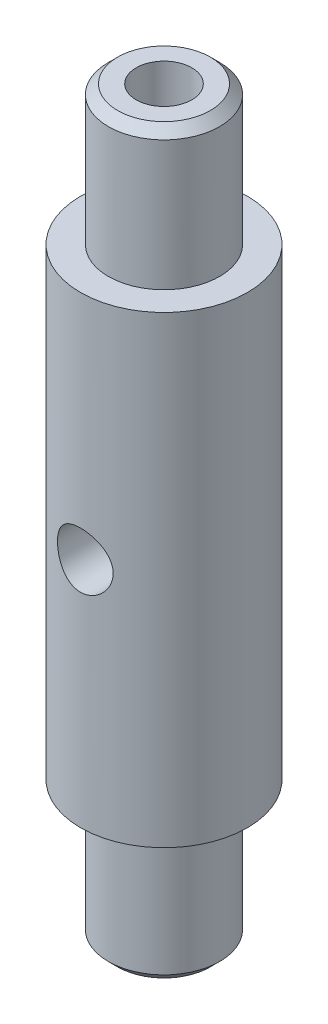
ISO-10303-21;
HEADER;
FILE_DESCRIPTION(('STEP AP214'),'2;1');
FILE_NAME('part.step','',(''),(''),'','','');
FILE_SCHEMA(('AUTOMOTIVE_DESIGN { 1 0 10303 214 1 1 1 1 }'));
ENDSEC;
DATA;
#1=APPLICATION_CONTEXT('core data for automotive mechanical design processes');
#2=APPLICATION_PROTOCOL_DEFINITION('international standard','automotive_design',2000,#1);
#3=PRODUCT_CONTEXT('',#1,'mechanical');
#4=PRODUCT('Part','Part','',(#3));
#5=PRODUCT_RELATED_PRODUCT_CATEGORY('part','',(#4));
#6=PRODUCT_DEFINITION_FORMATION('','',#4);
#7=PRODUCT_DEFINITION_CONTEXT('part definition',#1,'design');
#8=PRODUCT_DEFINITION('design','',#6,#7);
#9=PRODUCT_DEFINITION_SHAPE('','',#8);
#10=(LENGTH_UNIT() NAMED_UNIT(*) SI_UNIT(.MILLI.,.METRE.));
#11=(NAMED_UNIT(*) PLANE_ANGLE_UNIT() SI_UNIT($,.RADIAN.));
#12=(NAMED_UNIT(*) SI_UNIT($,.STERADIAN.) SOLID_ANGLE_UNIT());
#13=UNCERTAINTY_MEASURE_WITH_UNIT(LENGTH_MEASURE(1.E-05),#10,'distance_accuracy_value','');
#14=(GEOMETRIC_REPRESENTATION_CONTEXT(3) GLOBAL_UNCERTAINTY_ASSIGNED_CONTEXT((#13)) GLOBAL_UNIT_ASSIGNED_CONTEXT((#10,
#11,#12)) REPRESENTATION_CONTEXT('',''));
#15=CARTESIAN_POINT('',(0.,0.,0.));
#16=DIRECTION('',(0.,0.,1.));
#17=DIRECTION('',(1.,0.,0.));
#18=AXIS2_PLACEMENT_3D('',#15,#16,#17);
#19=CARTESIAN_POINT('',(0.,0.,-9.));
#20=DIRECTION('',(0.,0.,1.));
#21=DIRECTION('',(1.,0.,0.));
#22=AXIS2_PLACEMENT_3D('',#19,#20,#21);
#23=CYLINDRICAL_SURFACE('',#22,3.);
#24=CARTESIAN_POINT('',(0.,-3.00000000000001,9.));
#25=CARTESIAN_POINT('',(-0.16369008866017,-3.00000076119493,9.00000045902832));
#26=CARTESIAN_POINT('',(-0.32737558361565,-2.98655920161836,8.99549308522634));
#27=CARTESIAN_POINT('',(-0.649925282618917,-2.93331267354835,8.97795630609842));
#28=CARTESIAN_POINT('',(-0.808788984356454,-2.89350496815324,8.96492601606458));
#29=CARTESIAN_POINT('',(-1.11699836850533,-2.78904226984786,8.93175923719328));
#30=CARTESIAN_POINT('',(-1.2663594776581,-2.72442881262219,8.9116346319256));
#31=CARTESIAN_POINT('',(-1.55212481041598,-2.57237648148497,8.86633337152025));
#32=CARTESIAN_POINT('',(-1.68852647087612,-2.4849331049922,8.84115572003334));
#33=CARTESIAN_POINT('',(-1.9492250250668,-2.28652258542375,8.78742283329015));
#34=CARTESIAN_POINT('',(-2.07301110089493,-2.17490629721853,8.75878669391355));
#35=CARTESIAN_POINT('',(-2.30049807810625,-1.93269853588031,8.70180944349364));
#36=CARTESIAN_POINT('',(-2.40419455646839,-1.80210289521447,8.67346839871647));
#37=CARTESIAN_POINT('',(-2.59147482668358,-1.52104465441063,8.61939997431822));
#38=CARTESIAN_POINT('',(-2.6743945746631,-1.37011878080364,8.59377117827064));
#39=CARTESIAN_POINT('',(-2.81345662163316,-1.05547171662437,8.54925916255803));
#40=CARTESIAN_POINT('',(-2.8696070921603,-0.891754448511774,8.53037388482237));
#41=CARTESIAN_POINT('',(-2.95162038452749,-0.561980335509874,8.50233909808132));
#42=CARTESIAN_POINT('',(-2.97844034481531,-0.396188374532812,8.49288287308834));
#43=CARTESIAN_POINT('',(-3.00402337000343,-0.0622087375323628,8.48386969888523));
#44=CARTESIAN_POINT('',(-3.00279510481416,0.105978182127566,8.4843096906819));
#45=CARTESIAN_POINT('',(-2.97305971111026,0.431809891332058,8.49477045024541));
#46=CARTESIAN_POINT('',(-2.94580173950098,0.589585208757051,8.50435247602599));
#47=CARTESIAN_POINT('',(-2.86681848854825,0.898180258820498,8.53129973173653));
#48=CARTESIAN_POINT('',(-2.81509027977561,1.0489991563052,8.54866589352323));
#49=CARTESIAN_POINT('',(-2.68781717418063,1.34223824877443,8.58953733393746));
#50=CARTESIAN_POINT('',(-2.61190214612179,1.48448407640857,8.61313697379352));
#51=CARTESIAN_POINT('',(-2.43866731890942,1.75461272483917,8.66377675727179));
#52=CARTESIAN_POINT('',(-2.34134133709202,1.88249138080014,8.69081789371391));
#53=CARTESIAN_POINT('',(-2.12204799804671,2.12727479448231,8.74701987503223));
#54=CARTESIAN_POINT('',(-1.99905945022893,2.2432580835272,8.77621768064529));
#55=CARTESIAN_POINT('',(-1.73501870991019,2.45319379999019,8.8322081516111));
#56=CARTESIAN_POINT('',(-1.59396478698244,2.54714411449348,8.85900058614202));
#57=CARTESIAN_POINT('',(-1.2958428391388,2.7110889007052,8.90751323813381));
#58=CARTESIAN_POINT('',(-1.13862982924901,2.78083647402219,8.92918050024118));
#59=CARTESIAN_POINT('',(-0.813807250093521,2.89260952186713,8.96461701433305));
#60=CARTESIAN_POINT('',(-0.646201314464859,2.93464462627031,8.97838900964638));
#61=CARTESIAN_POINT('',(-0.31315148858791,2.98816699806707,8.99602881214321));
#62=CARTESIAN_POINT('',(-0.147928799594537,3.00089942751825,9.00030005501184));
#63=CARTESIAN_POINT('',(0.182325209880714,2.99900197920459,8.99966708084482));
#64=CARTESIAN_POINT('',(0.347356557958954,2.98437672006036,8.99476441258087));
#65=CARTESIAN_POINT('',(0.667559598912769,2.92916427679212,8.97660074151313));
#66=CARTESIAN_POINT('',(0.822878420504533,2.88934138185151,8.96358596133577));
#67=CARTESIAN_POINT('',(1.12456787573872,2.78581966659981,8.9307554049021));
#68=CARTESIAN_POINT('',(1.27093736552582,2.72211780159664,8.91093876140025));
#69=CARTESIAN_POINT('',(1.55486488917982,2.57078870447763,8.86586793861869));
#70=CARTESIAN_POINT('',(1.69208987765144,2.48257622015048,8.84048444267358));
#71=CARTESIAN_POINT('',(1.95019449040676,2.28541754995954,8.78715761748787));
#72=CARTESIAN_POINT('',(2.07106910338673,2.1764650319047,8.75921350781483));
#73=CARTESIAN_POINT('',(2.2987575234189,1.93506374698023,8.70230543941334));
#74=CARTESIAN_POINT('',(2.40468290773731,1.80177231921941,8.67335283262284));
#75=CARTESIAN_POINT('',(2.59277256697072,1.51868529656733,8.61899919884126));
#76=CARTESIAN_POINT('',(2.67493664379304,1.36888956409776,8.59359820146007));
#77=CARTESIAN_POINT('',(2.81279079124909,1.0569809541303,8.54947175374151));
#78=CARTESIAN_POINT('',(2.86853439649506,0.894893762493695,8.53073282378937));
#79=CARTESIAN_POINT('',(2.95168400027807,0.5628640498676,8.50232496919349));
#80=CARTESIAN_POINT('',(2.97910276486182,0.392925103786942,8.49265195870918));
#81=CARTESIAN_POINT('',(3.00382884743203,0.0594087118772417,8.48393576622531));
#82=CARTESIAN_POINT('',(3.0026107719252,-0.104047020860479,8.48437200772245));
#83=CARTESIAN_POINT('',(2.97372688034608,-0.428295224766196,8.49453809471602));
#84=CARTESIAN_POINT('',(2.94606263837576,-0.589087853865275,8.50426738708085));
#85=CARTESIAN_POINT('',(2.86611543938804,-0.900406989007426,8.53153572914675));
#86=CARTESIAN_POINT('',(2.81431003804654,-1.0510704750135,8.54892294067433));
#87=CARTESIAN_POINT('',(2.68793809727924,-1.34168222081482,8.58949196455406));
#88=CARTESIAN_POINT('',(2.61336650566142,-1.48162809356403,8.6126750629018));
#89=CARTESIAN_POINT('',(2.43978207775029,-1.75345100976874,8.66348487678139));
#90=CARTESIAN_POINT('',(2.33984472829374,-1.88470950569517,8.69126134926411));
#91=CARTESIAN_POINT('',(2.11992864940694,-2.12906944015261,8.74750068849759));
#92=CARTESIAN_POINT('',(1.99994425335444,-2.24216572706423,8.77596374737117));
#93=CARTESIAN_POINT('',(1.73772467076206,-2.45143323686754,8.83170091576632));
#94=CARTESIAN_POINT('',(1.59480454049918,-2.54677304325301,8.8588854540377));
#95=CARTESIAN_POINT('',(1.29407207221987,-2.71197128655195,8.90777973517836));
#96=CARTESIAN_POINT('',(1.13626355439704,-2.78183623776613,8.9294908772379));
#97=CARTESIAN_POINT('',(0.817480941602926,-2.89116489746602,8.96416545205626));
#98=CARTESIAN_POINT('',(0.656963273029225,-2.93184739879014,8.97747637267568));
#99=CARTESIAN_POINT('',(0.330961248030741,-2.98626084203139,8.99539221192665));
#100=CARTESIAN_POINT('',(0.165478276706239,-2.99999923048962,8.99999953595715));
#101=CARTESIAN_POINT('',(0.,-3.00000000000001,9.));
#102=B_SPLINE_CURVE_WITH_KNOTS('',3,(#24,#25,#26,#27,#28,#29,#30,#31,#32,#33,#34,#35,#36,#37,
#38,#39,#40,#41,#42,#43,#44,#45,#46,#47,#48,#49,#50,#51,#52,#53,#54,#55,#56,#57,#58,#59,#60,#61,
#62,#63,#64,#65,#66,#67,#68,#69,#70,#71,#72,#73,#74,#75,#76,#77,#78,#79,#80,#81,#82,#83,#84,#85,
#86,#87,#88,#89,#90,#91,#92,#93,#94,#95,#96,#97,#98,#99,#100,#101),.UNSPECIFIED.,.T.,.F.,(4,2,2,
2,2,2,2,2,2,2,2,2,2,2,2,2,2,2,2,2,2,2,2,2,2,2,2,2,2,2,2,2,2,2,2,2,2,2,4),(0.,0.490461318078033,
0.980973555802563,1.47066801861082,1.9604591333973,2.46554052848268,2.97073299862591,
3.49045154470412,4.010011340785,4.51205777225521,5.01394901962456,5.49290479653841,
5.97191792566446,6.45864513465392,6.94551307674622,7.45779917434101,7.97013437899855,
8.48755216951073,9.00479006631625,9.49960749525509,9.9943413949253,10.4747447393464,
10.9552093585231,11.4483119953121,11.9415654246567,12.4572306864226,12.9729002470499,
13.4875204148031,14.0019085411752,14.4898699819278,14.9778023805413,15.4564676124125,
15.9352391452793,16.4349020007541,16.9347063337134,17.453989825053,17.9731404345737,
18.4690967512144,18.9649159811442),.UNSPECIFIED.);
#103=CARTESIAN_POINT('',(0.,-3.00000000000001,9.));
#104=VERTEX_POINT('',#103);
#105=EDGE_CURVE('E80',#104,#104,#102,.T.);
#106=ORIENTED_EDGE('',*,*,#105,.F.);
#107=EDGE_LOOP('',(#106));
#108=FACE_BOUND('',#107,.T.);
#109=CARTESIAN_POINT('',(0.,0.,0.));
#110=DIRECTION('',(0.,-0.707106781186547,0.707106781186547));
#111=DIRECTION('',(0.,0.707106781186547,0.707106781186547));
#112=AXIS2_PLACEMENT_3D('',#109,#110,#111);
#113=ELLIPSE('',#112,4.24264068711928,2.99999999999999);
#114=CARTESIAN_POINT('',(-2.99999999999999,0.,0.));
#115=VERTEX_POINT('',#114);
#116=CARTESIAN_POINT('',(2.99999999999999,0.,0.));
#117=VERTEX_POINT('',#116);
#118=EDGE_CURVE('E59',#115,#117,#113,.F.);
#119=ORIENTED_EDGE('',*,*,#118,.T.);
#120=CARTESIAN_POINT('',(0.,0.,0.));
#121=DIRECTION('',(0.,0.707106781186547,0.707106781186547));
#122=DIRECTION('',(0.,-0.707106781186547,0.707106781186547));
#123=AXIS2_PLACEMENT_3D('',#120,#121,#122);
#124=ELLIPSE('',#123,4.24264068711928,2.99999999999999);
#125=EDGE_CURVE('E11',#117,#115,#124,.F.);
#126=ORIENTED_EDGE('',*,*,#125,.T.);
#127=EDGE_LOOP('',(#119,#126));
#128=FACE_BOUND('',#127,.T.);
#129=ADVANCED_FACE('F44',(#108,#128),#23,.F.);
#130=CARTESIAN_POINT('',(0.,-40.,0.));
#131=DIRECTION('',(0.,1.,0.));
#132=DIRECTION('',(0.,0.,1.));
#133=AXIS2_PLACEMENT_3D('',#130,#131,#132);
#134=PLANE('',#133);
#135=CARTESIAN_POINT('',(0.,-40.,0.));
#136=DIRECTION('',(0.,1.,0.));
#137=DIRECTION('',(0.,0.,1.));
#138=AXIS2_PLACEMENT_3D('',#135,#136,#137);
#139=CIRCLE('',#138,4.99999999999997);
#140=CARTESIAN_POINT('',(0.,-40.,4.99999999999997));
#141=VERTEX_POINT('',#140);
#142=EDGE_CURVE('E188',#141,#141,#139,.F.);
#143=ORIENTED_EDGE('',*,*,#142,.T.);
#144=EDGE_LOOP('',(#143));
#145=FACE_BOUND('',#144,.T.);
#146=ADVANCED_FACE('F149',(#145),#134,.F.);
#147=CARTESIAN_POINT('',(0.,40.,0.));
#148=DIRECTION('',(0.,1.,0.));
#149=DIRECTION('',(0.,0.,1.));
#150=AXIS2_PLACEMENT_3D('',#147,#148,#149);
#151=CYLINDRICAL_SURFACE('',#150,6.);
#152=CARTESIAN_POINT('',(0.,-39.,0.));
#153=DIRECTION('',(0.,1.,0.));
#154=DIRECTION('',(0.,0.,1.));
#155=AXIS2_PLACEMENT_3D('',#152,#153,#154);
#156=CIRCLE('',#155,6.);
#157=CARTESIAN_POINT('',(0.,-39.,6.));
#158=VERTEX_POINT('',#157);
#159=EDGE_CURVE('E114',#158,#158,#156,.T.);
#160=ORIENTED_EDGE('',*,*,#159,.T.);
#161=EDGE_LOOP('',(#160));
#162=FACE_BOUND('',#161,.T.);
#163=CARTESIAN_POINT('',(0.,-25.,0.));
#164=DIRECTION('',(0.,1.,0.));
#165=DIRECTION('',(0.,0.,1.));
#166=AXIS2_PLACEMENT_3D('',#163,#164,#165);
#167=CIRCLE('',#166,6.);
#168=CARTESIAN_POINT('',(0.,-25.,6.));
#169=VERTEX_POINT('',#168);
#170=EDGE_CURVE('E102',#169,#169,#167,.T.);
#171=ORIENTED_EDGE('',*,*,#170,.F.);
#172=EDGE_LOOP('',(#171));
#173=FACE_BOUND('',#172,.T.);
#174=ADVANCED_FACE('F154',(#162,#173),#151,.T.);
#175=CARTESIAN_POINT('',(6.,-25.,0.));
#176=DIRECTION('',(0.,1.,0.));
#177=DIRECTION('',(0.,0.,1.));
#178=AXIS2_PLACEMENT_3D('',#175,#176,#177);
#179=PLANE('',#178);
#180=CARTESIAN_POINT('',(0.,-25.,0.));
#181=DIRECTION('',(0.,1.,0.));
#182=DIRECTION('',(0.,0.,1.));
#183=AXIS2_PLACEMENT_3D('',#180,#181,#182);
#184=CIRCLE('',#183,9.);
#185=CARTESIAN_POINT('',(0.,-25.,9.));
#186=VERTEX_POINT('',#185);
#187=EDGE_CURVE('E98',#186,#186,#184,.T.);
#188=ORIENTED_EDGE('',*,*,#187,.F.);
#189=EDGE_LOOP('',(#188));
#190=FACE_BOUND('',#189,.T.);
#191=ORIENTED_EDGE('',*,*,#170,.T.);
#192=EDGE_LOOP('',(#191));
#193=FACE_BOUND('',#192,.T.);
#194=ADVANCED_FACE('F144',(#190,#193),#179,.F.);
#195=CARTESIAN_POINT('',(0.,40.,0.));
#196=DIRECTION('',(0.,1.,0.));
#197=DIRECTION('',(0.,0.,1.));
#198=AXIS2_PLACEMENT_3D('',#195,#196,#197);
#199=CYLINDRICAL_SURFACE('',#198,9.);
#200=ORIENTED_EDGE('',*,*,#105,.T.);
#201=EDGE_LOOP('',(#200));
#202=FACE_BOUND('',#201,.T.);
#203=CARTESIAN_POINT('',(0.,2.99999999999999,-9.));
#204=CARTESIAN_POINT('',(-0.16369008866017,3.00000076119492,-9.00000045902832));
#205=CARTESIAN_POINT('',(-0.32737558361565,2.98655920161834,-8.99549308522634));
#206=CARTESIAN_POINT('',(-0.649925282618917,2.93331267354834,-8.97795630609842));
#207=CARTESIAN_POINT('',(-0.808788984356454,2.89350496815323,-8.96492601606458));
#208=CARTESIAN_POINT('',(-1.11699836850533,2.78904226984785,-8.93175923719328));
#209=CARTESIAN_POINT('',(-1.2663594776581,2.72442881262218,-8.9116346319256));
#210=CARTESIAN_POINT('',(-1.55212481041597,2.57237648148495,-8.86633337152025));
#211=CARTESIAN_POINT('',(-1.68852647087612,2.48493310499219,-8.84115572003334));
#212=CARTESIAN_POINT('',(-1.9492250250668,2.28652258542373,-8.78742283329015));
#213=CARTESIAN_POINT('',(-2.07301110089493,2.17490629721851,-8.75878669391355));
#214=CARTESIAN_POINT('',(-2.30049807810625,1.93269853588029,-8.70180944349364));
#215=CARTESIAN_POINT('',(-2.40419455646839,1.80210289521445,-8.67346839871647));
#216=CARTESIAN_POINT('',(-2.59147482668358,1.52104465441061,-8.61939997431822));
#217=CARTESIAN_POINT('',(-2.6743945746631,1.37011878080363,-8.59377117827064));
#218=CARTESIAN_POINT('',(-2.81345662163316,1.05547171662435,-8.54925916255804));
#219=CARTESIAN_POINT('',(-2.8696070921603,0.891754448511761,-8.53037388482237));
#220=CARTESIAN_POINT('',(-2.95162038452749,0.561980335509861,-8.50233909808132));
#221=CARTESIAN_POINT('',(-2.97844034481531,0.396188374532799,-8.49288287308834));
#222=CARTESIAN_POINT('',(-3.00402337000343,0.0622087375323498,-8.48386969888523));
#223=CARTESIAN_POINT('',(-3.00279510481416,-0.105978182127579,-8.4843096906819));
#224=CARTESIAN_POINT('',(-2.97305971111026,-0.431809891332072,-8.49477045024541));
#225=CARTESIAN_POINT('',(-2.94580173950098,-0.589585208757064,-8.50435247602599));
#226=CARTESIAN_POINT('',(-2.86681848854825,-0.898180258820512,-8.53129973173653));
#227=CARTESIAN_POINT('',(-2.81509027977561,-1.04899915630522,-8.54866589352323));
#228=CARTESIAN_POINT('',(-2.68781717418063,-1.34223824877444,-8.58953733393746));
#229=CARTESIAN_POINT('',(-2.61190214612179,-1.48448407640859,-8.61313697379352));
#230=CARTESIAN_POINT('',(-2.43866731890942,-1.75461272483919,-8.66377675727179));
#231=CARTESIAN_POINT('',(-2.34134133709202,-1.88249138080015,-8.69081789371391));
#232=CARTESIAN_POINT('',(-2.12204799804671,-2.12727479448233,-8.74701987503223));
#233=CARTESIAN_POINT('',(-1.99905945022893,-2.24325808352722,-8.77621768064529));
#234=CARTESIAN_POINT('',(-1.73501870991019,-2.4531937999902,-8.8322081516111));
#235=CARTESIAN_POINT('',(-1.59396478698244,-2.5471441144935,-8.85900058614202));
#236=CARTESIAN_POINT('',(-1.2958428391388,-2.71108890070521,-8.90751323813381));
#237=CARTESIAN_POINT('',(-1.13862982924901,-2.7808364740222,-8.92918050024118));
#238=CARTESIAN_POINT('',(-0.813807250093522,-2.89260952186714,-8.96461701433305));
#239=CARTESIAN_POINT('',(-0.64620131446486,-2.93464462627032,-8.97838900964638));
#240=CARTESIAN_POINT('',(-0.313151488587911,-2.98816699806708,-8.99602881214321));
#241=CARTESIAN_POINT('',(-0.147928799594538,-3.00089942751826,-9.00030005501184));
#242=CARTESIAN_POINT('',(0.182325209880713,-2.9990019792046,-8.99966708084482));
#243=CARTESIAN_POINT('',(0.347356557958953,-2.98437672006038,-8.99476441258087));
#244=CARTESIAN_POINT('',(0.667559598912768,-2.92916427679213,-8.97660074151313));
#245=CARTESIAN_POINT('',(0.822878420504532,-2.88934138185152,-8.96358596133577));
#246=CARTESIAN_POINT('',(1.12456787573872,-2.78581966659982,-8.9307554049021));
#247=CARTESIAN_POINT('',(1.27093736552582,-2.72211780159665,-8.91093876140025));
#248=CARTESIAN_POINT('',(1.55486488917982,-2.57078870447765,-8.86586793861869));
#249=CARTESIAN_POINT('',(1.69208987765144,-2.4825762201505,-8.84048444267358));
#250=CARTESIAN_POINT('',(1.95019449040676,-2.28541754995956,-8.78715761748787));
#251=CARTESIAN_POINT('',(2.07106910338673,-2.17646503190471,-8.75921350781483));
#252=CARTESIAN_POINT('',(2.2987575234189,-1.93506374698024,-8.70230543941334));
#253=CARTESIAN_POINT('',(2.40468290773731,-1.80177231921942,-8.67335283262284));
#254=CARTESIAN_POINT('',(2.59277256697072,-1.51868529656734,-8.61899919884126));
#255=CARTESIAN_POINT('',(2.67493664379304,-1.36888956409778,-8.59359820146007));
#256=CARTESIAN_POINT('',(2.81279079124908,-1.05698095413032,-8.54947175374151));
#257=CARTESIAN_POINT('',(2.86853439649506,-0.89489376249371,-8.53073282378937));
#258=CARTESIAN_POINT('',(2.95168400027807,-0.562864049867615,-8.50232496919349));
#259=CARTESIAN_POINT('',(2.97910276486182,-0.392925103786958,-8.49265195870918));
#260=CARTESIAN_POINT('',(3.00382884743203,-0.0594087118772573,-8.48393576622531));
#261=CARTESIAN_POINT('',(3.0026107719252,0.104047020860463,-8.48437200772245));
#262=CARTESIAN_POINT('',(2.97372688034608,0.428295224766181,-8.49453809471602));
#263=CARTESIAN_POINT('',(2.94606263837576,0.58908785386526,-8.50426738708085));
#264=CARTESIAN_POINT('',(2.86611543938804,0.900406989007411,-8.53153572914675));
#265=CARTESIAN_POINT('',(2.81431003804654,1.05107047501348,-8.54892294067433));
#266=CARTESIAN_POINT('',(2.68793809727924,1.3416822208148,-8.58949196455406));
#267=CARTESIAN_POINT('',(2.61336650566142,1.48162809356401,-8.6126750629018));
#268=CARTESIAN_POINT('',(2.43978207775029,1.75345100976873,-8.66348487678139));
#269=CARTESIAN_POINT('',(2.33984472829374,1.88470950569515,-8.69126134926411));
#270=CARTESIAN_POINT('',(2.11992864940695,2.12906944015259,-8.74750068849759));
#271=CARTESIAN_POINT('',(1.99994425335444,2.24216572706422,-8.77596374737117));
#272=CARTESIAN_POINT('',(1.73772467076206,2.45143323686753,-8.83170091576632));
#273=CARTESIAN_POINT('',(1.59480454049919,2.54677304325299,-8.8588854540377));
#274=CARTESIAN_POINT('',(1.29407207221987,2.71197128655193,-8.90777973517836));
#275=CARTESIAN_POINT('',(1.13626355439704,2.78183623776612,-8.9294908772379));
#276=CARTESIAN_POINT('',(0.817480941602926,2.89116489746601,-8.96416545205626));
#277=CARTESIAN_POINT('',(0.656963273029224,2.93184739879012,-8.97747637267568));
#278=CARTESIAN_POINT('',(0.330961248030739,2.98626084203137,-8.99539221192666));
#279=CARTESIAN_POINT('',(0.165478276706238,2.9999992304896,-8.99999953595715));
#280=CARTESIAN_POINT('',(0.,2.99999999999999,-9.));
#281=B_SPLINE_CURVE_WITH_KNOTS('',3,(#203,#204,#205,#206,#207,#208,#209,#210,#211,#212,#213,
#214,#215,#216,#217,#218,#219,#220,#221,#222,#223,#224,#225,#226,#227,#228,#229,#230,#231,#232,
#233,#234,#235,#236,#237,#238,#239,#240,#241,#242,#243,#244,#245,#246,#247,#248,#249,#250,#251,
#252,#253,#254,#255,#256,#257,#258,#259,#260,#261,#262,#263,#264,#265,#266,#267,#268,#269,#270,
#271,#272,#273,#274,#275,#276,#277,#278,#279,#280),.UNSPECIFIED.,.T.,.F.,(4,2,2,2,2,2,2,2,2,2,2,
2,2,2,2,2,2,2,2,2,2,2,2,2,2,2,2,2,2,2,2,2,2,2,2,2,2,2,4),(0.,0.490461318078033,
0.980973555802562,1.47066801861082,1.9604591333973,2.46554052848268,2.97073299862591,
3.49045154470411,4.010011340785,4.5120577722552,5.01394901962456,5.49290479653841,
5.97191792566446,6.45864513465392,6.94551307674622,7.45779917434101,7.97013437899855,
8.48755216951073,9.00479006631625,9.49960749525509,9.9943413949253,10.4747447393464,
10.9552093585231,11.4483119953121,11.9415654246567,12.4572306864226,12.9729002470499,
13.4875204148031,14.0019085411752,14.4898699819277,14.9778023805413,15.4564676124125,
15.9352391452793,16.4349020007541,16.9347063337134,17.453989825053,17.9731404345737,
18.4690967512144,18.9649159811442),.UNSPECIFIED.);
#282=CARTESIAN_POINT('',(0.,2.99999999999999,-9.));
#283=VERTEX_POINT('',#282);
#284=EDGE_CURVE('E106',#283,#283,#281,.T.);
#285=ORIENTED_EDGE('',*,*,#284,.T.);
#286=EDGE_LOOP('',(#285));
#287=FACE_BOUND('',#286,.T.);
#288=CARTESIAN_POINT('',(0.,25.,0.));
#289=DIRECTION('',(0.,1.,0.));
#290=DIRECTION('',(0.,0.,1.));
#291=AXIS2_PLACEMENT_3D('',#288,#289,#290);
#292=CIRCLE('',#291,9.);
#293=CARTESIAN_POINT('',(0.,25.,9.));
#294=VERTEX_POINT('',#293);
#295=EDGE_CURVE('E94',#294,#294,#292,.T.);
#296=ORIENTED_EDGE('',*,*,#295,.F.);
#297=EDGE_LOOP('',(#296));
#298=FACE_BOUND('',#297,.T.);
#299=ORIENTED_EDGE('',*,*,#187,.T.);
#300=EDGE_LOOP('',(#299));
#301=FACE_BOUND('',#300,.T.);
#302=ADVANCED_FACE('F119',(#202,#287,#298,#301),#199,.T.);
#303=CARTESIAN_POINT('',(6.,25.,0.));
#304=DIRECTION('',(0.,-1.,0.));
#305=DIRECTION('',(0.,0.,-1.));
#306=AXIS2_PLACEMENT_3D('',#303,#304,#305);
#307=PLANE('',#306);
#308=CARTESIAN_POINT('',(0.,25.,0.));
#309=DIRECTION('',(0.,1.,0.));
#310=DIRECTION('',(0.,0.,1.));
#311=AXIS2_PLACEMENT_3D('',#308,#309,#310);
#312=CIRCLE('',#311,6.);
#313=CARTESIAN_POINT('',(0.,25.,6.));
#314=VERTEX_POINT('',#313);
#315=EDGE_CURVE('E86',#314,#314,#312,.T.);
#316=ORIENTED_EDGE('',*,*,#315,.F.);
#317=EDGE_LOOP('',(#316));
#318=FACE_BOUND('',#317,.T.);
#319=ORIENTED_EDGE('',*,*,#295,.T.);
#320=EDGE_LOOP('',(#319));
#321=FACE_BOUND('',#320,.T.);
#322=ADVANCED_FACE('F137',(#318,#321),#307,.F.);
#323=CARTESIAN_POINT('',(0.,40.,0.));
#324=DIRECTION('',(0.,1.,0.));
#325=DIRECTION('',(0.,0.,1.));
#326=AXIS2_PLACEMENT_3D('',#323,#324,#325);
#327=CYLINDRICAL_SURFACE('',#326,6.);
#328=CARTESIAN_POINT('',(0.,39.,0.));
#329=DIRECTION('',(0.,-1.,0.));
#330=DIRECTION('',(0.,0.,-1.));
#331=AXIS2_PLACEMENT_3D('',#328,#329,#330);
#332=CIRCLE('',#331,6.);
#333=CARTESIAN_POINT('',(0.,39.,-6.));
#334=VERTEX_POINT('',#333);
#335=EDGE_CURVE('E198',#334,#334,#332,.T.);
#336=ORIENTED_EDGE('',*,*,#335,.T.);
#337=EDGE_LOOP('',(#336));
#338=FACE_BOUND('',#337,.T.);
#339=ORIENTED_EDGE('',*,*,#315,.T.);
#340=EDGE_LOOP('',(#339));
#341=FACE_BOUND('',#340,.T.);
#342=ADVANCED_FACE('F134',(#338,#341),#327,.T.);
#343=CARTESIAN_POINT('',(0.,40.,0.));
#344=DIRECTION('',(0.,-1.,0.));
#345=DIRECTION('',(0.,0.,-1.));
#346=AXIS2_PLACEMENT_3D('',#343,#344,#345);
#347=PLANE('',#346);
#348=CARTESIAN_POINT('',(0.,40.,0.));
#349=DIRECTION('',(0.,1.,0.));
#350=DIRECTION('',(0.,0.,1.));
#351=AXIS2_PLACEMENT_3D('',#348,#349,#350);
#352=CIRCLE('',#351,2.99999999999999);
#353=CARTESIAN_POINT('',(0.,40.,2.99999999999999));
#354=VERTEX_POINT('',#353);
#355=EDGE_CURVE('E81',#354,#354,#352,.T.);
#356=ORIENTED_EDGE('',*,*,#355,.F.);
#357=EDGE_LOOP('',(#356));
#358=FACE_BOUND('',#357,.T.);
#359=CARTESIAN_POINT('',(0.,40.,0.));
#360=DIRECTION('',(0.,-1.,0.));
#361=DIRECTION('',(0.,0.,-1.));
#362=AXIS2_PLACEMENT_3D('',#359,#360,#361);
#363=CIRCLE('',#362,4.99999999999998);
#364=CARTESIAN_POINT('',(0.,40.,-4.99999999999998));
#365=VERTEX_POINT('',#364);
#366=EDGE_CURVE('E192',#365,#365,#363,.F.);
#367=ORIENTED_EDGE('',*,*,#366,.T.);
#368=EDGE_LOOP('',(#367));
#369=FACE_BOUND('',#368,.T.);
#370=ADVANCED_FACE('F128',(#358,#369),#347,.F.);
#371=CARTESIAN_POINT('',(0.,0.,0.));
#372=DIRECTION('',(0.,-0.707106781186547,0.707106781186547));
#373=DIRECTION('',(0.,0.707106781186547,0.707106781186547));
#374=AXIS2_PLACEMENT_3D('',#371,#372,#373);
#375=ELLIPSE('',#374,4.24264068711928,2.99999999999999);
#376=EDGE_CURVE('E66',#115,#117,#375,.T.);
#377=ORIENTED_EDGE('',*,*,#376,.T.);
#378=CARTESIAN_POINT('',(0.,0.,0.));
#379=DIRECTION('',(0.,0.707106781186547,0.707106781186547));
#380=DIRECTION('',(0.,-0.707106781186547,0.707106781186547));
#381=AXIS2_PLACEMENT_3D('',#378,#379,#380);
#382=ELLIPSE('',#381,4.24264068711928,2.99999999999999);
#383=EDGE_CURVE('E54',#117,#115,#382,.T.);
#384=ORIENTED_EDGE('',*,*,#383,.T.);
#385=EDGE_LOOP('',(#377,#384));
#386=FACE_BOUND('',#385,.T.);
#387=ORIENTED_EDGE('',*,*,#284,.F.);
#388=EDGE_LOOP('',(#387));
#389=FACE_BOUND('',#388,.T.);
#390=ADVANCED_FACE('F123',(#386,#389),#23,.F.);
#391=CARTESIAN_POINT('',(0.,-39.,0.));
#392=DIRECTION('',(0.,1.,0.));
#393=DIRECTION('',(0.,0.,1.));
#394=AXIS2_PLACEMENT_3D('',#391,#392,#393);
#395=CONICAL_SURFACE('',#394,6.,0.78539816339746);
#396=ORIENTED_EDGE('',*,*,#142,.F.);
#397=EDGE_LOOP('',(#396));
#398=FACE_BOUND('',#397,.T.);
#399=ORIENTED_EDGE('',*,*,#159,.F.);
#400=EDGE_LOOP('',(#399));
#401=FACE_BOUND('',#400,.T.);
#402=ADVANCED_FACE('F127',(#398,#401),#395,.T.);
#403=CARTESIAN_POINT('',(0.,40.,0.));
#404=DIRECTION('',(0.,-1.,0.));
#405=DIRECTION('',(0.,0.,-1.));
#406=AXIS2_PLACEMENT_3D('',#403,#404,#405);
#407=CONICAL_SURFACE('',#406,4.99999999999998,0.785398163397446);
#408=ORIENTED_EDGE('',*,*,#335,.F.);
#409=EDGE_LOOP('',(#408));
#410=FACE_BOUND('',#409,.T.);
#411=ORIENTED_EDGE('',*,*,#366,.F.);
#412=EDGE_LOOP('',(#411));
#413=FACE_BOUND('',#412,.T.);
#414=ADVANCED_FACE('F47',(#410,#413),#407,.T.);
#415=CARTESIAN_POINT('',(0.,40.,0.));
#416=DIRECTION('',(0.,1.,0.));
#417=DIRECTION('',(0.,0.,1.));
#418=AXIS2_PLACEMENT_3D('',#415,#416,#417);
#419=CYLINDRICAL_SURFACE('',#418,2.99999999999999);
#420=ORIENTED_EDGE('',*,*,#355,.T.);
#421=EDGE_LOOP('',(#420));
#422=FACE_BOUND('',#421,.T.);
#423=ORIENTED_EDGE('',*,*,#118,.F.);
#424=ORIENTED_EDGE('',*,*,#383,.F.);
#425=EDGE_LOOP('',(#423,#424));
#426=FACE_BOUND('',#425,.T.);
#427=ADVANCED_FACE('F183',(#422,#426),#419,.F.);
#428=CARTESIAN_POINT('',(0.,-5.,0.));
#429=DIRECTION('',(0.,1.,0.));
#430=DIRECTION('',(0.,0.,1.));
#431=AXIS2_PLACEMENT_3D('',#428,#429,#430);
#432=CIRCLE('',#431,2.99999999999998);
#433=CARTESIAN_POINT('',(0.,-5.,2.99999999999998));
#434=VERTEX_POINT('',#433);
#435=EDGE_CURVE('E77',#434,#434,#432,.T.);
#436=ORIENTED_EDGE('',*,*,#435,.F.);
#437=EDGE_LOOP('',(#436));
#438=FACE_BOUND('',#437,.T.);
#439=ORIENTED_EDGE('',*,*,#376,.F.);
#440=ORIENTED_EDGE('',*,*,#125,.F.);
#441=EDGE_LOOP('',(#439,#440));
#442=FACE_BOUND('',#441,.T.);
#443=ADVANCED_FACE('F73',(#438,#442),#419,.F.);
#444=CARTESIAN_POINT('',(0.,-5.,0.));
#445=DIRECTION('',(0.,1.,0.));
#446=DIRECTION('',(0.,0.,1.));
#447=AXIS2_PLACEMENT_3D('',#444,#445,#446);
#448=CONICAL_SURFACE('',#447,2.99999999999998,1.02974425867665);
#449=CARTESIAN_POINT('',(0.,-6.80258185708268,0.));
#450=VERTEX_POINT('',#449);
#451=VERTEX_LOOP('',#450);
#452=FACE_BOUND('',#451,.T.);
#453=ORIENTED_EDGE('',*,*,#435,.T.);
#454=EDGE_LOOP('',(#453));
#455=FACE_BOUND('',#454,.T.);
#456=ADVANCED_FACE('F70',(#452,#455),#448,.F.);
#457=CLOSED_SHELL('',(#129,#146,#174,#194,#302,#322,#342,#370,#390,#402,#414,#427,#443,#456));
#458=MANIFOLD_SOLID_BREP('B2',#457);
#459=ADVANCED_BREP_SHAPE_REPRESENTATION('',(#18,#458),#14);
#460=SHAPE_DEFINITION_REPRESENTATION(#9,#459);
ENDSEC;
END-ISO-10303-21;
